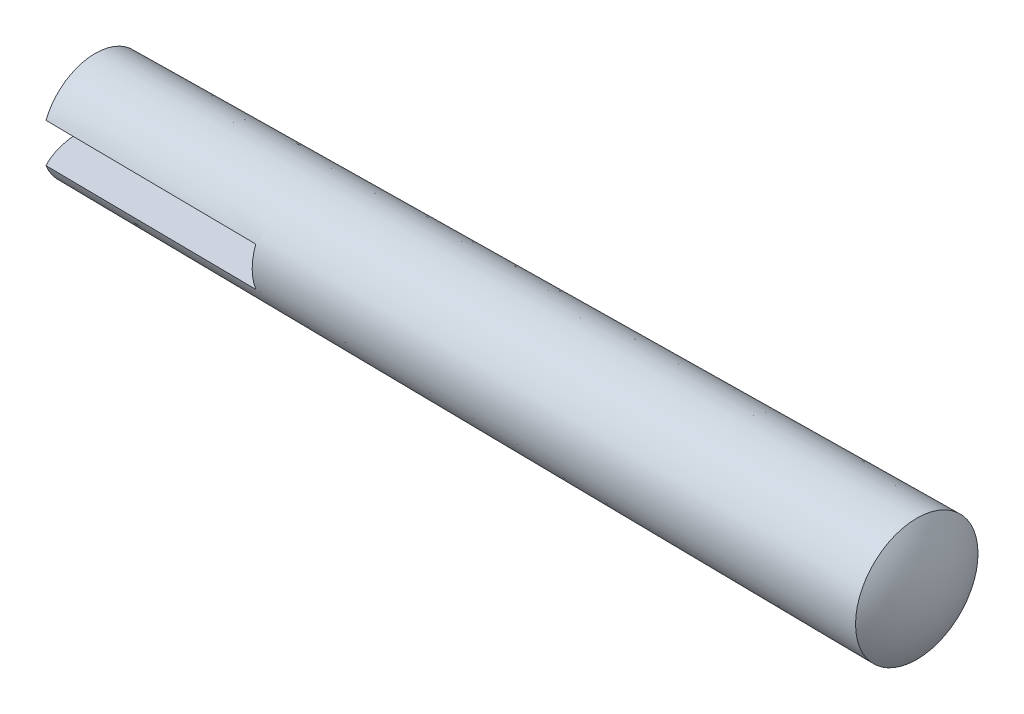
ISO-10303-21;
HEADER;
FILE_DESCRIPTION(('STEP AP214'),'2;1');
FILE_NAME('part.step','',(''),(''),'','','');
FILE_SCHEMA(('AUTOMOTIVE_DESIGN { 1 0 10303 214 1 1 1 1 }'));
ENDSEC;
DATA;
#1=APPLICATION_CONTEXT('core data for automotive mechanical design processes');
#2=APPLICATION_PROTOCOL_DEFINITION('international standard','automotive_design',2000,#1);
#3=PRODUCT_CONTEXT('',#1,'mechanical');
#4=PRODUCT('Part','Part','',(#3));
#5=PRODUCT_RELATED_PRODUCT_CATEGORY('part','',(#4));
#6=PRODUCT_DEFINITION_FORMATION('','',#4);
#7=PRODUCT_DEFINITION_CONTEXT('part definition',#1,'design');
#8=PRODUCT_DEFINITION('design','',#6,#7);
#9=PRODUCT_DEFINITION_SHAPE('','',#8);
#10=(LENGTH_UNIT() NAMED_UNIT(*) SI_UNIT(.MILLI.,.METRE.));
#11=(NAMED_UNIT(*) PLANE_ANGLE_UNIT() SI_UNIT($,.RADIAN.));
#12=(NAMED_UNIT(*) SI_UNIT($,.STERADIAN.) SOLID_ANGLE_UNIT());
#13=UNCERTAINTY_MEASURE_WITH_UNIT(LENGTH_MEASURE(1.E-05),#10,'distance_accuracy_value','');
#14=(GEOMETRIC_REPRESENTATION_CONTEXT(3) GLOBAL_UNCERTAINTY_ASSIGNED_CONTEXT((#13)) GLOBAL_UNIT_ASSIGNED_CONTEXT((#10,
#11,#12)) REPRESENTATION_CONTEXT('',''));
#15=CARTESIAN_POINT('',(0.,0.,0.));
#16=DIRECTION('',(0.,0.,1.));
#17=DIRECTION('',(1.,0.,0.));
#18=AXIS2_PLACEMENT_3D('',#15,#16,#17);
#19=CARTESIAN_POINT('',(4.33012701892219,0.,0.));
#20=DIRECTION('',(-1.,0.,0.));
#21=DIRECTION('',(0.,1.,0.));
#22=AXIS2_PLACEMENT_3D('',#19,#20,#21);
#23=SPHERICAL_SURFACE('',#22,5.);
#24=CARTESIAN_POINT('',(4.33012701892219,-0.925107708851634,0.));
#25=DIRECTION('',(0.,1.,0.));
#26=DIRECTION('',(0.,0.,1.));
#27=AXIS2_PLACEMENT_3D('',#24,#25,#26);
#28=CIRCLE('',#27,4.91367232597202);
#29=CARTESIAN_POINT('',(0.,-0.925107708851633,-2.32253648561724));
#30=VERTEX_POINT('',#29);
#31=CARTESIAN_POINT('',(0.,-0.925107708851634,2.32253648561729));
#32=VERTEX_POINT('',#31);
#33=EDGE_CURVE('E79',#30,#32,#28,.T.);
#34=ORIENTED_EDGE('',*,*,#33,.F.);
#35=CARTESIAN_POINT('',(0.,0.,0.));
#36=DIRECTION('',(-1.,0.,0.));
#37=DIRECTION('',(0.,0.,1.));
#38=AXIS2_PLACEMENT_3D('',#35,#36,#37);
#39=CIRCLE('',#38,2.5);
#40=EDGE_CURVE('E100',#30,#32,#39,.T.);
#41=ORIENTED_EDGE('',*,*,#40,.T.);
#42=EDGE_LOOP('',(#34,#41));
#43=FACE_BOUND('',#42,.T.);
#44=ADVANCED_FACE('F32',(#43),#23,.T.);
#45=CARTESIAN_POINT('',(4.33012701892219,0.925107708851633,0.));
#46=DIRECTION('',(0.,-1.,0.));
#47=DIRECTION('',(0.,0.,-1.));
#48=AXIS2_PLACEMENT_3D('',#45,#46,#47);
#49=CIRCLE('',#48,4.91367232597202);
#50=CARTESIAN_POINT('',(0.,0.925107708851633,2.32253648561729));
#51=VERTEX_POINT('',#50);
#52=CARTESIAN_POINT('',(0.,0.925107708851633,-2.32253648561724));
#53=VERTEX_POINT('',#52);
#54=EDGE_CURVE('E108',#51,#53,#49,.T.);
#55=ORIENTED_EDGE('',*,*,#54,.F.);
#56=EDGE_CURVE('E97',#51,#53,#39,.T.);
#57=ORIENTED_EDGE('',*,*,#56,.T.);
#58=EDGE_LOOP('',(#55,#57));
#59=FACE_BOUND('',#58,.T.);
#60=ADVANCED_FACE('F112',(#59),#23,.T.);
#61=CARTESIAN_POINT('',(38.74,0.,0.));
#62=DIRECTION('',(1.,0.,0.));
#63=DIRECTION('',(0.,0.,-1.));
#64=AXIS2_PLACEMENT_3D('',#61,#62,#63);
#65=CONICAL_SURFACE('',#64,2.88739999953784,0.00999966667473666);
#66=CARTESIAN_POINT('',(38.74,0.,0.));
#67=DIRECTION('',(-1.,0.,0.));
#68=DIRECTION('',(0.,0.,1.));
#69=AXIS2_PLACEMENT_3D('',#66,#67,#68);
#70=CIRCLE('',#69,2.88739999953784);
#71=CARTESIAN_POINT('',(38.74,0.,2.88739999953784));
#72=VERTEX_POINT('',#71);
#73=EDGE_CURVE('E103',#72,#72,#70,.T.);
#74=ORIENTED_EDGE('',*,*,#73,.T.);
#75=EDGE_LOOP('',(#74));
#76=FACE_BOUND('',#75,.T.);
#77=CARTESIAN_POINT('',(-4.33933013735769,-0.925107708851634,2.27576189418266));
#78=CARTESIAN_POINT('',(-2.68514700873873,-0.925107708851634,2.29361806642426));
#79=CARTESIAN_POINT('',(-1.0309635618294,-0.925107708851634,2.31144471926445));
#80=CARTESIAN_POINT('',(2.27740393042958,-0.925107708851634,2.3470424070635));
#81=CARTESIAN_POINT('',(3.93158797577922,-0.925107708851634,2.36481344202236));
#82=CARTESIAN_POINT('',(12.2025096134902,-0.925107708851634,2.45353812452663));
#83=CARTESIAN_POINT('',(18.8192514084222,-0.925107708851634,2.52410029487546));
#84=CARTESIAN_POINT('',(25.4359964662892,-0.925107708851634,2.59435435904378));
#85=B_SPLINE_CURVE_WITH_KNOTS('',3,(#77,#78,#79,#80,#81,#82,#83,#84),.UNSPECIFIED.,.F.,.F.,(4,2,
2,4),(0.,4.96283850069788,9.92567700133145,29.7770310341848),.UNSPECIFIED.);
#86=CARTESIAN_POINT('',(10.,-0.925107708851634,2.42985096794082));
#87=VERTEX_POINT('',#86);
#88=EDGE_CURVE('E11',#32,#87,#85,.T.);
#89=ORIENTED_EDGE('',*,*,#88,.F.);
#90=ORIENTED_EDGE('',*,*,#40,.F.);
#91=CARTESIAN_POINT('',(-4.33933013735769,-0.925107708851633,-2.27576189418266));
#92=CARTESIAN_POINT('',(-2.68514700873873,-0.925107708851633,-2.29361806642426));
#93=CARTESIAN_POINT('',(-1.0309635618294,-0.925107708851633,-2.31144471926445));
#94=CARTESIAN_POINT('',(2.27740393042958,-0.925107708851633,-2.3470424070635));
#95=CARTESIAN_POINT('',(3.93158797577922,-0.925107708851633,-2.36481344202236));
#96=CARTESIAN_POINT('',(12.2025096134902,-0.925107708851633,-2.45353812452663));
#97=CARTESIAN_POINT('',(18.8192514084222,-0.925107708851633,-2.52410029487545));
#98=CARTESIAN_POINT('',(25.4359964662892,-0.925107708851633,-2.59435435904378));
#99=B_SPLINE_CURVE_WITH_KNOTS('',3,(#91,#92,#93,#94,#95,#96,#97,#98),.UNSPECIFIED.,.F.,.F.,(4,2,
2,4),(0.,4.96283850069788,9.92567700133145,29.7770310341848),.UNSPECIFIED.);
#100=CARTESIAN_POINT('',(10.,-0.925107708851633,-2.42985096794082));
#101=VERTEX_POINT('',#100);
#102=EDGE_CURVE('E60',#101,#30,#99,.F.);
#103=ORIENTED_EDGE('',*,*,#102,.F.);
#104=CARTESIAN_POINT('',(10.,0.,0.));
#105=DIRECTION('',(1.,0.,0.));
#106=DIRECTION('',(0.,0.,-1.));
#107=AXIS2_PLACEMENT_3D('',#104,#105,#106);
#108=CIRCLE('',#107,2.5999999998807);
#109=CARTESIAN_POINT('',(10.,0.925107708851633,-2.42985096794082));
#110=VERTEX_POINT('',#109);
#111=EDGE_CURVE('E87',#101,#110,#108,.T.);
#112=ORIENTED_EDGE('',*,*,#111,.T.);
#113=CARTESIAN_POINT('',(-4.33933013735769,0.925107708851633,-2.27576189418266));
#114=CARTESIAN_POINT('',(-2.68514700873873,0.925107708851633,-2.29361806642426));
#115=CARTESIAN_POINT('',(-1.0309635618294,0.925107708851633,-2.31144471926445));
#116=CARTESIAN_POINT('',(2.27740393042958,0.925107708851633,-2.3470424070635));
#117=CARTESIAN_POINT('',(3.93158797577922,0.925107708851633,-2.36481344202236));
#118=CARTESIAN_POINT('',(12.2025096134902,0.925107708851633,-2.45353812452663));
#119=CARTESIAN_POINT('',(18.8192514084222,0.925107708851633,-2.52410029487545));
#120=CARTESIAN_POINT('',(25.4359964662892,0.925107708851633,-2.59435435904378));
#121=B_SPLINE_CURVE_WITH_KNOTS('',3,(#113,#114,#115,#116,#117,#118,#119,#120),.UNSPECIFIED.,.F.,
.F.,(4,2,2,4),(0.,4.96283850069788,9.92567700133145,29.7770310341848),.UNSPECIFIED.);
#122=EDGE_CURVE('E93',#53,#110,#121,.T.);
#123=ORIENTED_EDGE('',*,*,#122,.F.);
#124=ORIENTED_EDGE('',*,*,#56,.F.);
#125=CARTESIAN_POINT('',(-4.33933013735769,0.925107708851633,2.27576189418266));
#126=CARTESIAN_POINT('',(-2.68514700873873,0.925107708851633,2.29361806642426));
#127=CARTESIAN_POINT('',(-1.0309635618294,0.925107708851633,2.31144471926445));
#128=CARTESIAN_POINT('',(2.27740393042958,0.925107708851633,2.3470424070635));
#129=CARTESIAN_POINT('',(3.93158797577922,0.925107708851633,2.36481344202236));
#130=CARTESIAN_POINT('',(12.2025096134902,0.925107708851633,2.45353812452663));
#131=CARTESIAN_POINT('',(18.8192514084222,0.925107708851633,2.52410029487546));
#132=CARTESIAN_POINT('',(25.4359964662892,0.925107708851633,2.59435435904378));
#133=B_SPLINE_CURVE_WITH_KNOTS('',3,(#125,#126,#127,#128,#129,#130,#131,#132),.UNSPECIFIED.,.F.,
.F.,(4,2,2,4),(0.,4.96283850069788,9.92567700133145,29.7770310341848),.UNSPECIFIED.);
#134=CARTESIAN_POINT('',(10.,0.925107708851632,2.42985096794082));
#135=VERTEX_POINT('',#134);
#136=EDGE_CURVE('E45',#135,#51,#133,.F.);
#137=ORIENTED_EDGE('',*,*,#136,.F.);
#138=EDGE_CURVE('E85',#135,#87,#108,.T.);
#139=ORIENTED_EDGE('',*,*,#138,.T.);
#140=EDGE_LOOP('',(#89,#90,#103,#112,#123,#124,#137,#139));
#141=FACE_BOUND('',#140,.T.);
#142=ADVANCED_FACE('F90',(#76,#141),#65,.T.);
#143=CARTESIAN_POINT('',(34.657975840019,0.,0.));
#144=DIRECTION('',(-1.,0.,0.));
#145=DIRECTION('',(0.,-1.,0.));
#146=AXIS2_PLACEMENT_3D('',#143,#144,#145);
#147=SPHERICAL_SURFACE('',#146,5.);
#148=ORIENTED_EDGE('',*,*,#73,.F.);
#149=EDGE_LOOP('',(#148));
#150=FACE_BOUND('',#149,.T.);
#151=ADVANCED_FACE('F34',(#150),#147,.T.);
#152=CARTESIAN_POINT('',(10.,-0.925107708851633,-2.88739999953784));
#153=DIRECTION('',(0.,1.,0.));
#154=DIRECTION('',(0.,0.,1.));
#155=AXIS2_PLACEMENT_3D('',#152,#153,#154);
#156=PLANE('',#155);
#157=ORIENTED_EDGE('',*,*,#102,.T.);
#158=ORIENTED_EDGE('',*,*,#33,.T.);
#159=ORIENTED_EDGE('',*,*,#88,.T.);
#160=DIRECTION('',(0.,0.,-1.));
#161=VECTOR('',#160,1.);
#162=CARTESIAN_POINT('',(10.,-0.925107708851633,-2.88739999953784));
#163=LINE('',#162,#161);
#164=EDGE_CURVE('E78',#87,#101,#163,.T.);
#165=ORIENTED_EDGE('',*,*,#164,.T.);
#166=EDGE_LOOP('',(#157,#158,#159,#165));
#167=FACE_BOUND('',#166,.T.);
#168=ADVANCED_FACE('F77',(#167),#156,.T.);
#169=CARTESIAN_POINT('',(10.,0.925107708851633,-2.88739999953784));
#170=DIRECTION('',(0.,-1.,0.));
#171=DIRECTION('',(0.,0.,-1.));
#172=AXIS2_PLACEMENT_3D('',#169,#170,#171);
#173=PLANE('',#172);
#174=ORIENTED_EDGE('',*,*,#122,.T.);
#175=DIRECTION('',(0.,0.,1.));
#176=VECTOR('',#175,1.);
#177=CARTESIAN_POINT('',(10.,0.925107708851633,-2.88739999953784));
#178=LINE('',#177,#176);
#179=EDGE_CURVE('E52',#110,#135,#178,.T.);
#180=ORIENTED_EDGE('',*,*,#179,.T.);
#181=ORIENTED_EDGE('',*,*,#136,.T.);
#182=ORIENTED_EDGE('',*,*,#54,.T.);
#183=EDGE_LOOP('',(#174,#180,#181,#182));
#184=FACE_BOUND('',#183,.T.);
#185=ADVANCED_FACE('F111',(#184),#173,.T.);
#186=CARTESIAN_POINT('',(10.,0.925107708851633,2.88739999953784));
#187=DIRECTION('',(1.,0.,0.));
#188=DIRECTION('',(0.,0.,-1.));
#189=AXIS2_PLACEMENT_3D('',#186,#187,#188);
#190=PLANE('',#189);
#191=ORIENTED_EDGE('',*,*,#179,.F.);
#192=ORIENTED_EDGE('',*,*,#111,.F.);
#193=ORIENTED_EDGE('',*,*,#164,.F.);
#194=ORIENTED_EDGE('',*,*,#138,.F.);
#195=EDGE_LOOP('',(#191,#192,#193,#194));
#196=FACE_BOUND('',#195,.T.);
#197=ADVANCED_FACE('F84',(#196),#190,.F.);
#198=CLOSED_SHELL('',(#44,#60,#142,#151,#168,#185,#197));
#199=MANIFOLD_SOLID_BREP('B2',#198);
#200=ADVANCED_BREP_SHAPE_REPRESENTATION('',(#18,#199),#14);
#201=SHAPE_DEFINITION_REPRESENTATION(#9,#200);
ENDSEC;
END-ISO-10303-21;
